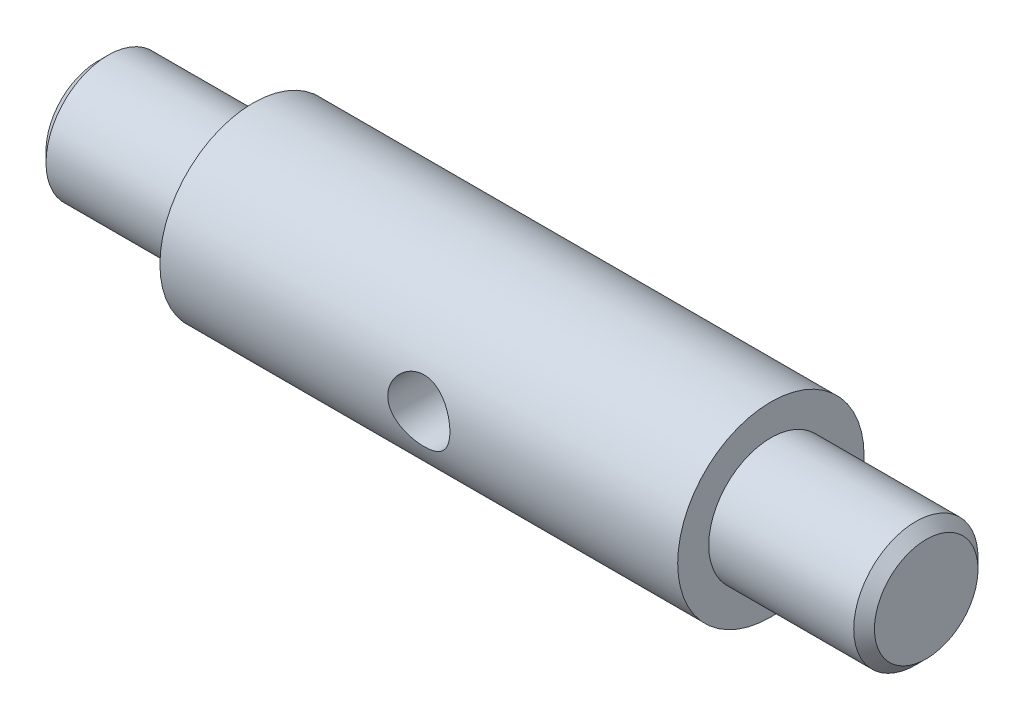
ISO-10303-21;
HEADER;
FILE_DESCRIPTION(('STEP AP214'),'2;1');
FILE_NAME('part.step','',(''),(''),'','','');
FILE_SCHEMA(('AUTOMOTIVE_DESIGN { 1 0 10303 214 1 1 1 1 }'));
ENDSEC;
DATA;
#1=APPLICATION_CONTEXT('core data for automotive mechanical design processes');
#2=APPLICATION_PROTOCOL_DEFINITION('international standard','automotive_design',2000,#1);
#3=PRODUCT_CONTEXT('',#1,'mechanical');
#4=PRODUCT('Part','Part','',(#3));
#5=PRODUCT_RELATED_PRODUCT_CATEGORY('part','',(#4));
#6=PRODUCT_DEFINITION_FORMATION('','',#4);
#7=PRODUCT_DEFINITION_CONTEXT('part definition',#1,'design');
#8=PRODUCT_DEFINITION('design','',#6,#7);
#9=PRODUCT_DEFINITION_SHAPE('','',#8);
#10=(LENGTH_UNIT() NAMED_UNIT(*) SI_UNIT(.MILLI.,.METRE.));
#11=(NAMED_UNIT(*) PLANE_ANGLE_UNIT() SI_UNIT($,.RADIAN.));
#12=(NAMED_UNIT(*) SI_UNIT($,.STERADIAN.) SOLID_ANGLE_UNIT());
#13=UNCERTAINTY_MEASURE_WITH_UNIT(LENGTH_MEASURE(1.E-05),#10,'distance_accuracy_value','');
#14=(GEOMETRIC_REPRESENTATION_CONTEXT(3) GLOBAL_UNCERTAINTY_ASSIGNED_CONTEXT((#13)) GLOBAL_UNIT_ASSIGNED_CONTEXT((#10,
#11,#12)) REPRESENTATION_CONTEXT('',''));
#15=CARTESIAN_POINT('',(0.,0.,0.));
#16=DIRECTION('',(0.,0.,1.));
#17=DIRECTION('',(1.,0.,0.));
#18=AXIS2_PLACEMENT_3D('',#15,#16,#17);
#19=CARTESIAN_POINT('',(0.,0.,-9.00000000000001));
#20=DIRECTION('',(0.,0.,1.));
#21=DIRECTION('',(1.,0.,0.));
#22=AXIS2_PLACEMENT_3D('',#19,#20,#21);
#23=CYLINDRICAL_SURFACE('',#22,3.);
#24=CARTESIAN_POINT('',(3.,0.,9.00000000000001));
#25=CARTESIAN_POINT('',(3.00000076119492,-0.16369008866017,9.00000045902833));
#26=CARTESIAN_POINT('',(2.98655920161835,-0.32737558361565,8.99549308522635));
#27=CARTESIAN_POINT('',(2.93331267354834,-0.649925282618917,8.97795630609843));
#28=CARTESIAN_POINT('',(2.89350496815323,-0.808788984356453,8.96492601606458));
#29=CARTESIAN_POINT('',(2.78904226984785,-1.11699836850533,8.93175923719328));
#30=CARTESIAN_POINT('',(2.72442881262219,-1.2663594776581,8.9116346319256));
#31=CARTESIAN_POINT('',(2.57237648148496,-1.55212481041597,8.86633337152026));
#32=CARTESIAN_POINT('',(2.4849331049922,-1.68852647087612,8.84115572003334));
#33=CARTESIAN_POINT('',(2.28652258542374,-1.9492250250668,8.78742283329015));
#34=CARTESIAN_POINT('',(2.17490629721852,-2.07301110089493,8.75878669391355));
#35=CARTESIAN_POINT('',(1.9326985358803,-2.30049807810625,8.70180944349365));
#36=CARTESIAN_POINT('',(1.80210289521446,-2.40419455646839,8.67346839871647));
#37=CARTESIAN_POINT('',(1.52104465441062,-2.59147482668358,8.61939997431822));
#38=CARTESIAN_POINT('',(1.37011878080363,-2.6743945746631,8.59377117827065));
#39=CARTESIAN_POINT('',(1.05547171662436,-2.81345662163316,8.54925916255804));
#40=CARTESIAN_POINT('',(0.891754448511768,-2.86960709216029,8.53037388482237));
#41=CARTESIAN_POINT('',(0.561980335509868,-2.95162038452749,8.50233909808132));
#42=CARTESIAN_POINT('',(0.396188374532806,-2.97844034481531,8.49288287308834));
#43=CARTESIAN_POINT('',(0.0622087375323573,-3.00402337000343,8.48386969888523));
#44=CARTESIAN_POINT('',(-0.105978182127572,-3.00279510481416,8.4843096906819));
#45=CARTESIAN_POINT('',(-0.431809891332064,-2.97305971111026,8.49477045024541));
#46=CARTESIAN_POINT('',(-0.589585208757056,-2.94580173950098,8.50435247602599));
#47=CARTESIAN_POINT('',(-0.898180258820504,-2.86681848854825,8.53129973173653));
#48=CARTESIAN_POINT('',(-1.04899915630521,-2.81509027977561,8.54866589352323));
#49=CARTESIAN_POINT('',(-1.34223824877444,-2.68781717418063,8.58953733393747));
#50=CARTESIAN_POINT('',(-1.48448407640858,-2.61190214612179,8.61313697379352));
#51=CARTESIAN_POINT('',(-1.75461272483918,-2.43866731890942,8.6637767572718));
#52=CARTESIAN_POINT('',(-1.88249138080014,-2.34134133709202,8.69081789371391));
#53=CARTESIAN_POINT('',(-2.12727479448232,-2.12204799804671,8.74701987503223));
#54=CARTESIAN_POINT('',(-2.24325808352721,-1.99905945022893,8.77621768064529));
#55=CARTESIAN_POINT('',(-2.45319379999019,-1.73501870991019,8.8322081516111));
#56=CARTESIAN_POINT('',(-2.54714411449349,-1.59396478698244,8.85900058614202));
#57=CARTESIAN_POINT('',(-2.71108890070521,-1.2958428391388,8.90751323813381));
#58=CARTESIAN_POINT('',(-2.7808364740222,-1.13862982924901,8.92918050024118));
#59=CARTESIAN_POINT('',(-2.89260952186713,-0.813807250093524,8.96461701433305));
#60=CARTESIAN_POINT('',(-2.93464462627031,-0.646201314464862,8.97838900964638));
#61=CARTESIAN_POINT('',(-2.98816699806708,-0.313151488587913,8.99602881214322));
#62=CARTESIAN_POINT('',(-3.00089942751825,-0.14792879959454,9.00030005501184));
#63=CARTESIAN_POINT('',(-2.99900197920459,0.182325209880711,8.99966708084482));
#64=CARTESIAN_POINT('',(-2.98437672006037,0.34735655795895,8.99476441258087));
#65=CARTESIAN_POINT('',(-2.92916427679212,0.667559598912766,8.97660074151313));
#66=CARTESIAN_POINT('',(-2.88934138185152,0.822878420504529,8.96358596133577));
#67=CARTESIAN_POINT('',(-2.78581966659982,1.12456787573872,8.9307554049021));
#68=CARTESIAN_POINT('',(-2.72211780159664,1.27093736552582,8.91093876140025));
#69=CARTESIAN_POINT('',(-2.57078870447764,1.55486488917982,8.86586793861869));
#70=CARTESIAN_POINT('',(-2.48257622015049,1.69208987765144,8.84048444267359));
#71=CARTESIAN_POINT('',(-2.28541754995955,1.95019449040676,8.78715761748788));
#72=CARTESIAN_POINT('',(-2.17646503190471,2.07106910338673,8.75921350781483));
#73=CARTESIAN_POINT('',(-1.93506374698024,2.2987575234189,8.70230543941334));
#74=CARTESIAN_POINT('',(-1.80177231921942,2.40468290773731,8.67335283262284));
#75=CARTESIAN_POINT('',(-1.51868529656734,2.59277256697072,8.61899919884127));
#76=CARTESIAN_POINT('',(-1.36888956409777,2.67493664379304,8.59359820146007));
#77=CARTESIAN_POINT('',(-1.05698095413031,2.81279079124908,8.54947175374151));
#78=CARTESIAN_POINT('',(-0.894893762493705,2.86853439649506,8.53073282378937));
#79=CARTESIAN_POINT('',(-0.56286404986761,2.95168400027807,8.50232496919349));
#80=CARTESIAN_POINT('',(-0.392925103786953,2.97910276486182,8.49265195870918));
#81=CARTESIAN_POINT('',(-0.0594087118772516,3.00382884743203,8.48393576622532));
#82=CARTESIAN_POINT('',(0.10404702086047,3.0026107719252,8.48437200772246));
#83=CARTESIAN_POINT('',(0.428295224766187,2.97372688034608,8.49453809471602));
#84=CARTESIAN_POINT('',(0.589087853865265,2.94606263837576,8.50426738708085));
#85=CARTESIAN_POINT('',(0.900406989007416,2.86611543938804,8.53153572914675));
#86=CARTESIAN_POINT('',(1.05107047501349,2.81431003804654,8.54892294067433));
#87=CARTESIAN_POINT('',(1.34168222081481,2.68793809727924,8.58949196455406));
#88=CARTESIAN_POINT('',(1.48162809356402,2.61336650566142,8.6126750629018));
#89=CARTESIAN_POINT('',(1.75345100976873,2.43978207775029,8.66348487678139));
#90=CARTESIAN_POINT('',(1.88470950569516,2.33984472829374,8.69126134926412));
#91=CARTESIAN_POINT('',(2.1290694401526,2.11992864940695,8.74750068849759));
#92=CARTESIAN_POINT('',(2.24216572706422,1.99994425335445,8.77596374737117));
#93=CARTESIAN_POINT('',(2.45143323686753,1.73772467076207,8.83170091576632));
#94=CARTESIAN_POINT('',(2.546773043253,1.59480454049919,8.8588854540377));
#95=CARTESIAN_POINT('',(2.71197128655194,1.29407207221988,8.90777973517837));
#96=CARTESIAN_POINT('',(2.78183623776613,1.13626355439705,8.9294908772379));
#97=CARTESIAN_POINT('',(2.89116489746602,0.817480941602929,8.96416545205626));
#98=CARTESIAN_POINT('',(2.93184739879013,0.656963273029227,8.97747637267568));
#99=CARTESIAN_POINT('',(2.98626084203138,0.330961248030742,8.99539221192666));
#100=CARTESIAN_POINT('',(2.99999923048961,0.165478276706239,8.99999953595715));
#101=CARTESIAN_POINT('',(3.,0.,9.00000000000001));
#102=B_SPLINE_CURVE_WITH_KNOTS('',3,(#24,#25,#26,#27,#28,#29,#30,#31,#32,#33,#34,#35,#36,#37,
#38,#39,#40,#41,#42,#43,#44,#45,#46,#47,#48,#49,#50,#51,#52,#53,#54,#55,#56,#57,#58,#59,#60,#61,
#62,#63,#64,#65,#66,#67,#68,#69,#70,#71,#72,#73,#74,#75,#76,#77,#78,#79,#80,#81,#82,#83,#84,#85,
#86,#87,#88,#89,#90,#91,#92,#93,#94,#95,#96,#97,#98,#99,#100,#101),.UNSPECIFIED.,.T.,.F.,(4,2,2,
2,2,2,2,2,2,2,2,2,2,2,2,2,2,2,2,2,2,2,2,2,2,2,2,2,2,2,2,2,2,2,2,2,2,2,4),(0.,0.490461318078033,
0.980973555802562,1.47066801861082,1.9604591333973,2.46554052848268,2.97073299862591,
3.49045154470412,4.010011340785,4.5120577722552,5.01394901962456,5.49290479653841,
5.97191792566446,6.45864513465392,6.94551307674622,7.45779917434101,7.97013437899855,
8.48755216951073,9.00479006631625,9.49960749525509,9.9943413949253,10.4747447393464,
10.9552093585231,11.4483119953121,11.9415654246567,12.4572306864226,12.9729002470499,
13.4875204148031,14.0019085411752,14.4898699819277,14.9778023805413,15.4564676124125,
15.9352391452793,16.4349020007541,16.9347063337134,17.453989825053,17.9731404345737,
18.4690967512144,18.9649159811442),.UNSPECIFIED.);
#103=CARTESIAN_POINT('',(3.,0.,9.00000000000001));
#104=VERTEX_POINT('',#103);
#105=EDGE_CURVE('E106',#104,#104,#102,.T.);
#106=ORIENTED_EDGE('',*,*,#105,.F.);
#107=EDGE_LOOP('',(#106));
#108=FACE_BOUND('',#107,.T.);
#109=CARTESIAN_POINT('',(0.,0.,0.));
#110=DIRECTION('',(0.707106781186547,0.,0.707106781186547));
#111=DIRECTION('',(-0.707106781186547,0.,0.707106781186547));
#112=AXIS2_PLACEMENT_3D('',#109,#110,#111);
#113=ELLIPSE('',#112,4.24264068711928,3.);
#114=CARTESIAN_POINT('',(0.,-3.,0.));
#115=VERTEX_POINT('',#114);
#116=CARTESIAN_POINT('',(0.,3.,0.));
#117=VERTEX_POINT('',#116);
#118=EDGE_CURVE('E62',#115,#117,#113,.F.);
#119=ORIENTED_EDGE('',*,*,#118,.T.);
#120=CARTESIAN_POINT('',(0.,0.,0.));
#121=DIRECTION('',(-0.707106781186547,0.,0.707106781186547));
#122=DIRECTION('',(0.707106781186547,0.,0.707106781186547));
#123=AXIS2_PLACEMENT_3D('',#120,#121,#122);
#124=ELLIPSE('',#123,4.24264068711928,3.);
#125=EDGE_CURVE('E192',#117,#115,#124,.F.);
#126=ORIENTED_EDGE('',*,*,#125,.T.);
#127=EDGE_LOOP('',(#119,#126));
#128=FACE_BOUND('',#127,.T.);
#129=ADVANCED_FACE('F46',(#108,#128),#23,.F.);
#130=CARTESIAN_POINT('',(-40.,0.,0.));
#131=DIRECTION('',(1.,0.,0.));
#132=DIRECTION('',(0.,0.,-1.));
#133=AXIS2_PLACEMENT_3D('',#130,#131,#132);
#134=PLANE('',#133);
#135=CARTESIAN_POINT('',(-40.,0.,0.));
#136=DIRECTION('',(1.,0.,0.));
#137=DIRECTION('',(0.,0.,-1.));
#138=AXIS2_PLACEMENT_3D('',#135,#136,#137);
#139=CIRCLE('',#138,4.99999999999998);
#140=CARTESIAN_POINT('',(-40.,0.,-4.99999999999998));
#141=VERTEX_POINT('',#140);
#142=EDGE_CURVE('E56',#141,#141,#139,.F.);
#143=ORIENTED_EDGE('',*,*,#142,.T.);
#144=EDGE_LOOP('',(#143));
#145=FACE_BOUND('',#144,.T.);
#146=CARTESIAN_POINT('',(-40.,0.,0.));
#147=DIRECTION('',(-1.,0.,0.));
#148=DIRECTION('',(0.,0.,1.));
#149=AXIS2_PLACEMENT_3D('',#146,#147,#148);
#150=CIRCLE('',#149,3.);
#151=CARTESIAN_POINT('',(-40.,0.,3.));
#152=VERTEX_POINT('',#151);
#153=EDGE_CURVE('E85',#152,#152,#150,.T.);
#154=ORIENTED_EDGE('',*,*,#153,.F.);
#155=EDGE_LOOP('',(#154));
#156=FACE_BOUND('',#155,.T.);
#157=ADVANCED_FACE('F151',(#145,#156),#134,.F.);
#158=CARTESIAN_POINT('',(0.,0.,0.));
#159=DIRECTION('',(-1.,0.,0.));
#160=DIRECTION('',(0.,0.,1.));
#161=AXIS2_PLACEMENT_3D('',#158,#159,#160);
#162=CYLINDRICAL_SURFACE('',#161,6.);
#163=CARTESIAN_POINT('',(-39.,0.,0.));
#164=DIRECTION('',(1.,0.,0.));
#165=DIRECTION('',(0.,0.,-1.));
#166=AXIS2_PLACEMENT_3D('',#163,#164,#165);
#167=CIRCLE('',#166,6.);
#168=CARTESIAN_POINT('',(-39.,0.,-6.));
#169=VERTEX_POINT('',#168);
#170=EDGE_CURVE('E11',#169,#169,#167,.T.);
#171=ORIENTED_EDGE('',*,*,#170,.T.);
#172=EDGE_LOOP('',(#171));
#173=FACE_BOUND('',#172,.T.);
#174=CARTESIAN_POINT('',(-25.,0.,0.));
#175=DIRECTION('',(-1.,0.,0.));
#176=DIRECTION('',(0.,0.,1.));
#177=AXIS2_PLACEMENT_3D('',#174,#175,#176);
#178=CIRCLE('',#177,6.);
#179=CARTESIAN_POINT('',(-25.,0.,6.));
#180=VERTEX_POINT('',#179);
#181=EDGE_CURVE('E102',#180,#180,#178,.T.);
#182=ORIENTED_EDGE('',*,*,#181,.T.);
#183=EDGE_LOOP('',(#182));
#184=FACE_BOUND('',#183,.T.);
#185=ADVANCED_FACE('F157',(#173,#184),#162,.T.);
#186=CARTESIAN_POINT('',(-25.,6.,0.));
#187=DIRECTION('',(1.,0.,0.));
#188=DIRECTION('',(0.,0.,-1.));
#189=AXIS2_PLACEMENT_3D('',#186,#187,#188);
#190=PLANE('',#189);
#191=ORIENTED_EDGE('',*,*,#181,.F.);
#192=EDGE_LOOP('',(#191));
#193=FACE_BOUND('',#192,.T.);
#194=CARTESIAN_POINT('',(-25.,0.,0.));
#195=DIRECTION('',(-1.,0.,0.));
#196=DIRECTION('',(0.,0.,1.));
#197=AXIS2_PLACEMENT_3D('',#194,#195,#196);
#198=CIRCLE('',#197,9.);
#199=CARTESIAN_POINT('',(-25.,0.,9.));
#200=VERTEX_POINT('',#199);
#201=EDGE_CURVE('E98',#200,#200,#198,.T.);
#202=ORIENTED_EDGE('',*,*,#201,.T.);
#203=EDGE_LOOP('',(#202));
#204=FACE_BOUND('',#203,.T.);
#205=ADVANCED_FACE('F146',(#193,#204),#190,.F.);
#206=CARTESIAN_POINT('',(0.,0.,0.));
#207=DIRECTION('',(-1.,0.,0.));
#208=DIRECTION('',(0.,0.,1.));
#209=AXIS2_PLACEMENT_3D('',#206,#207,#208);
#210=CYLINDRICAL_SURFACE('',#209,9.);
#211=CARTESIAN_POINT('',(3.,0.,-9.));
#212=CARTESIAN_POINT('',(3.00000076119492,0.16369008866017,-9.00000045902832));
#213=CARTESIAN_POINT('',(2.98655920161835,0.32737558361565,-8.99549308522635));
#214=CARTESIAN_POINT('',(2.93331267354834,0.649925282618917,-8.97795630609843));
#215=CARTESIAN_POINT('',(2.89350496815323,0.808788984356453,-8.96492601606458));
#216=CARTESIAN_POINT('',(2.78904226984785,1.11699836850533,-8.93175923719328));
#217=CARTESIAN_POINT('',(2.72442881262219,1.2663594776581,-8.9116346319256));
#218=CARTESIAN_POINT('',(2.57237648148496,1.55212481041597,-8.86633337152026));
#219=CARTESIAN_POINT('',(2.4849331049922,1.68852647087612,-8.84115572003334));
#220=CARTESIAN_POINT('',(2.28652258542374,1.9492250250668,-8.78742283329015));
#221=CARTESIAN_POINT('',(2.17490629721852,2.07301110089493,-8.75878669391355));
#222=CARTESIAN_POINT('',(1.9326985358803,2.30049807810625,-8.70180944349365));
#223=CARTESIAN_POINT('',(1.80210289521446,2.40419455646839,-8.67346839871647));
#224=CARTESIAN_POINT('',(1.52104465441062,2.59147482668358,-8.61939997431822));
#225=CARTESIAN_POINT('',(1.37011878080363,2.6743945746631,-8.59377117827065));
#226=CARTESIAN_POINT('',(1.05547171662436,2.81345662163316,-8.54925916255804));
#227=CARTESIAN_POINT('',(0.891754448511768,2.86960709216029,-8.53037388482237));
#228=CARTESIAN_POINT('',(0.561980335509868,2.95162038452749,-8.50233909808132));
#229=CARTESIAN_POINT('',(0.396188374532806,2.97844034481531,-8.49288287308834));
#230=CARTESIAN_POINT('',(0.0622087375323573,3.00402337000343,-8.48386969888523));
#231=CARTESIAN_POINT('',(-0.105978182127572,3.00279510481416,-8.4843096906819));
#232=CARTESIAN_POINT('',(-0.431809891332064,2.97305971111026,-8.49477045024541));
#233=CARTESIAN_POINT('',(-0.589585208757056,2.94580173950098,-8.50435247602599));
#234=CARTESIAN_POINT('',(-0.898180258820504,2.86681848854825,-8.53129973173653));
#235=CARTESIAN_POINT('',(-1.04899915630521,2.81509027977561,-8.54866589352323));
#236=CARTESIAN_POINT('',(-1.34223824877444,2.68781717418063,-8.58953733393747));
#237=CARTESIAN_POINT('',(-1.48448407640858,2.61190214612179,-8.61313697379352));
#238=CARTESIAN_POINT('',(-1.75461272483918,2.43866731890942,-8.6637767572718));
#239=CARTESIAN_POINT('',(-1.88249138080014,2.34134133709202,-8.69081789371391));
#240=CARTESIAN_POINT('',(-2.12727479448232,2.12204799804671,-8.74701987503223));
#241=CARTESIAN_POINT('',(-2.24325808352721,1.99905945022893,-8.77621768064529));
#242=CARTESIAN_POINT('',(-2.45319379999019,1.73501870991019,-8.8322081516111));
#243=CARTESIAN_POINT('',(-2.54714411449349,1.59396478698244,-8.85900058614202));
#244=CARTESIAN_POINT('',(-2.71108890070521,1.2958428391388,-8.90751323813381));
#245=CARTESIAN_POINT('',(-2.7808364740222,1.13862982924901,-8.92918050024118));
#246=CARTESIAN_POINT('',(-2.89260952186713,0.813807250093524,-8.96461701433305));
#247=CARTESIAN_POINT('',(-2.93464462627031,0.646201314464862,-8.97838900964638));
#248=CARTESIAN_POINT('',(-2.98816699806708,0.313151488587913,-8.99602881214322));
#249=CARTESIAN_POINT('',(-3.00089942751825,0.14792879959454,-9.00030005501184));
#250=CARTESIAN_POINT('',(-2.99900197920459,-0.182325209880711,-8.99966708084482));
#251=CARTESIAN_POINT('',(-2.98437672006037,-0.34735655795895,-8.99476441258087));
#252=CARTESIAN_POINT('',(-2.92916427679212,-0.667559598912766,-8.97660074151313));
#253=CARTESIAN_POINT('',(-2.88934138185152,-0.822878420504529,-8.96358596133577));
#254=CARTESIAN_POINT('',(-2.78581966659982,-1.12456787573872,-8.9307554049021));
#255=CARTESIAN_POINT('',(-2.72211780159664,-1.27093736552582,-8.91093876140025));
#256=CARTESIAN_POINT('',(-2.57078870447764,-1.55486488917982,-8.86586793861869));
#257=CARTESIAN_POINT('',(-2.48257622015049,-1.69208987765144,-8.84048444267359));
#258=CARTESIAN_POINT('',(-2.28541754995955,-1.95019449040676,-8.78715761748788));
#259=CARTESIAN_POINT('',(-2.17646503190471,-2.07106910338673,-8.75921350781483));
#260=CARTESIAN_POINT('',(-1.93506374698024,-2.2987575234189,-8.70230543941334));
#261=CARTESIAN_POINT('',(-1.80177231921942,-2.40468290773731,-8.67335283262284));
#262=CARTESIAN_POINT('',(-1.51868529656734,-2.59277256697072,-8.61899919884127));
#263=CARTESIAN_POINT('',(-1.36888956409777,-2.67493664379304,-8.59359820146007));
#264=CARTESIAN_POINT('',(-1.05698095413031,-2.81279079124908,-8.54947175374151));
#265=CARTESIAN_POINT('',(-0.894893762493705,-2.86853439649506,-8.53073282378937));
#266=CARTESIAN_POINT('',(-0.56286404986761,-2.95168400027807,-8.50232496919349));
#267=CARTESIAN_POINT('',(-0.392925103786953,-2.97910276486182,-8.49265195870918));
#268=CARTESIAN_POINT('',(-0.0594087118772516,-3.00382884743203,-8.48393576622532));
#269=CARTESIAN_POINT('',(0.10404702086047,-3.0026107719252,-8.48437200772246));
#270=CARTESIAN_POINT('',(0.428295224766187,-2.97372688034608,-8.49453809471602));
#271=CARTESIAN_POINT('',(0.589087853865265,-2.94606263837576,-8.50426738708085));
#272=CARTESIAN_POINT('',(0.900406989007416,-2.86611543938804,-8.53153572914675));
#273=CARTESIAN_POINT('',(1.05107047501349,-2.81431003804654,-8.54892294067433));
#274=CARTESIAN_POINT('',(1.34168222081481,-2.68793809727924,-8.58949196455406));
#275=CARTESIAN_POINT('',(1.48162809356402,-2.61336650566142,-8.6126750629018));
#276=CARTESIAN_POINT('',(1.75345100976873,-2.43978207775029,-8.66348487678139));
#277=CARTESIAN_POINT('',(1.88470950569516,-2.33984472829374,-8.69126134926412));
#278=CARTESIAN_POINT('',(2.1290694401526,-2.11992864940695,-8.74750068849759));
#279=CARTESIAN_POINT('',(2.24216572706422,-1.99994425335445,-8.77596374737117));
#280=CARTESIAN_POINT('',(2.45143323686753,-1.73772467076207,-8.83170091576632));
#281=CARTESIAN_POINT('',(2.546773043253,-1.59480454049919,-8.8588854540377));
#282=CARTESIAN_POINT('',(2.71197128655194,-1.29407207221988,-8.90777973517837));
#283=CARTESIAN_POINT('',(2.78183623776613,-1.13626355439705,-8.9294908772379));
#284=CARTESIAN_POINT('',(2.89116489746602,-0.817480941602929,-8.96416545205626));
#285=CARTESIAN_POINT('',(2.93184739879013,-0.656963273029227,-8.97747637267568));
#286=CARTESIAN_POINT('',(2.98626084203138,-0.330961248030742,-8.99539221192665));
#287=CARTESIAN_POINT('',(2.99999923048961,-0.16547827670624,-8.99999953595715));
#288=CARTESIAN_POINT('',(3.,0.,-9.));
#289=B_SPLINE_CURVE_WITH_KNOTS('',3,(#211,#212,#213,#214,#215,#216,#217,#218,#219,#220,#221,
#222,#223,#224,#225,#226,#227,#228,#229,#230,#231,#232,#233,#234,#235,#236,#237,#238,#239,#240,
#241,#242,#243,#244,#245,#246,#247,#248,#249,#250,#251,#252,#253,#254,#255,#256,#257,#258,#259,
#260,#261,#262,#263,#264,#265,#266,#267,#268,#269,#270,#271,#272,#273,#274,#275,#276,#277,#278,
#279,#280,#281,#282,#283,#284,#285,#286,#287,#288),.UNSPECIFIED.,.T.,.F.,(4,2,2,2,2,2,2,2,2,2,2,
2,2,2,2,2,2,2,2,2,2,2,2,2,2,2,2,2,2,2,2,2,2,2,2,2,2,2,4),(0.,0.490461318078033,
0.980973555802562,1.47066801861082,1.9604591333973,2.46554052848268,2.97073299862591,
3.49045154470411,4.010011340785,4.5120577722552,5.01394901962456,5.49290479653841,
5.97191792566446,6.45864513465392,6.94551307674622,7.45779917434101,7.97013437899855,
8.48755216951073,9.00479006631625,9.49960749525509,9.9943413949253,10.4747447393464,
10.9552093585231,11.4483119953121,11.9415654246567,12.4572306864226,12.9729002470499,
13.4875204148031,14.0019085411752,14.4898699819277,14.9778023805413,15.4564676124125,
15.9352391452793,16.4349020007541,16.9347063337134,17.453989825053,17.9731404345737,
18.4690967512144,18.9649159811442),.UNSPECIFIED.);
#290=CARTESIAN_POINT('',(3.,0.,-9.));
#291=VERTEX_POINT('',#290);
#292=EDGE_CURVE('E115',#291,#291,#289,.T.);
#293=ORIENTED_EDGE('',*,*,#292,.T.);
#294=EDGE_LOOP('',(#293));
#295=FACE_BOUND('',#294,.T.);
#296=ORIENTED_EDGE('',*,*,#105,.T.);
#297=EDGE_LOOP('',(#296));
#298=FACE_BOUND('',#297,.T.);
#299=ORIENTED_EDGE('',*,*,#201,.F.);
#300=EDGE_LOOP('',(#299));
#301=FACE_BOUND('',#300,.T.);
#302=CARTESIAN_POINT('',(25.,0.,0.));
#303=DIRECTION('',(-1.,0.,0.));
#304=DIRECTION('',(0.,0.,1.));
#305=AXIS2_PLACEMENT_3D('',#302,#303,#304);
#306=CIRCLE('',#305,9.00000000000001);
#307=CARTESIAN_POINT('',(25.,0.,9.00000000000001));
#308=VERTEX_POINT('',#307);
#309=EDGE_CURVE('E90',#308,#308,#306,.T.);
#310=ORIENTED_EDGE('',*,*,#309,.T.);
#311=EDGE_LOOP('',(#310));
#312=FACE_BOUND('',#311,.T.);
#313=ADVANCED_FACE('F120',(#295,#298,#301,#312),#210,.T.);
#314=CARTESIAN_POINT('',(25.,9.00000000000001,0.));
#315=DIRECTION('',(-1.,0.,0.));
#316=DIRECTION('',(0.,0.,1.));
#317=AXIS2_PLACEMENT_3D('',#314,#315,#316);
#318=PLANE('',#317);
#319=ORIENTED_EDGE('',*,*,#309,.F.);
#320=EDGE_LOOP('',(#319));
#321=FACE_BOUND('',#320,.T.);
#322=CARTESIAN_POINT('',(25.,0.,0.));
#323=DIRECTION('',(-1.,0.,0.));
#324=DIRECTION('',(0.,0.,1.));
#325=AXIS2_PLACEMENT_3D('',#322,#323,#324);
#326=CIRCLE('',#325,6.00000000000001);
#327=CARTESIAN_POINT('',(25.,0.,6.00000000000001));
#328=VERTEX_POINT('',#327);
#329=EDGE_CURVE('E84',#328,#328,#326,.T.);
#330=ORIENTED_EDGE('',*,*,#329,.T.);
#331=EDGE_LOOP('',(#330));
#332=FACE_BOUND('',#331,.T.);
#333=ADVANCED_FACE('F138',(#321,#332),#318,.F.);
#334=CARTESIAN_POINT('',(0.,0.,0.));
#335=DIRECTION('',(-1.,0.,0.));
#336=DIRECTION('',(0.,0.,1.));
#337=AXIS2_PLACEMENT_3D('',#334,#335,#336);
#338=CYLINDRICAL_SURFACE('',#337,6.00000000000001);
#339=CARTESIAN_POINT('',(39.,0.,0.));
#340=DIRECTION('',(-1.,0.,0.));
#341=DIRECTION('',(0.,0.,1.));
#342=AXIS2_PLACEMENT_3D('',#339,#340,#341);
#343=CIRCLE('',#342,6.00000000000001);
#344=CARTESIAN_POINT('',(39.,0.,6.00000000000001));
#345=VERTEX_POINT('',#344);
#346=EDGE_CURVE('E190',#345,#345,#343,.T.);
#347=ORIENTED_EDGE('',*,*,#346,.T.);
#348=EDGE_LOOP('',(#347));
#349=FACE_BOUND('',#348,.T.);
#350=ORIENTED_EDGE('',*,*,#329,.F.);
#351=EDGE_LOOP('',(#350));
#352=FACE_BOUND('',#351,.T.);
#353=ADVANCED_FACE('F135',(#349,#352),#338,.T.);
#354=CARTESIAN_POINT('',(40.,6.00000000000001,0.));
#355=DIRECTION('',(-1.,0.,0.));
#356=DIRECTION('',(0.,0.,1.));
#357=AXIS2_PLACEMENT_3D('',#354,#355,#356);
#358=PLANE('',#357);
#359=CARTESIAN_POINT('',(40.,0.,0.));
#360=DIRECTION('',(-1.,0.,0.));
#361=DIRECTION('',(0.,0.,1.));
#362=AXIS2_PLACEMENT_3D('',#359,#360,#361);
#363=CIRCLE('',#362,5.);
#364=CARTESIAN_POINT('',(40.,0.,5.));
#365=VERTEX_POINT('',#364);
#366=EDGE_CURVE('E187',#365,#365,#363,.F.);
#367=ORIENTED_EDGE('',*,*,#366,.T.);
#368=EDGE_LOOP('',(#367));
#369=FACE_BOUND('',#368,.T.);
#370=ADVANCED_FACE('F129',(#369),#358,.F.);
#371=CARTESIAN_POINT('',(0.,0.,0.));
#372=DIRECTION('',(0.707106781186547,0.,0.707106781186547));
#373=DIRECTION('',(-0.707106781186547,0.,0.707106781186547));
#374=AXIS2_PLACEMENT_3D('',#371,#372,#373);
#375=ELLIPSE('',#374,4.24264068711928,3.);
#376=EDGE_CURVE('E69',#115,#117,#375,.T.);
#377=ORIENTED_EDGE('',*,*,#376,.T.);
#378=CARTESIAN_POINT('',(0.,0.,0.));
#379=DIRECTION('',(-0.707106781186547,0.,0.707106781186547));
#380=DIRECTION('',(0.707106781186547,0.,0.707106781186547));
#381=AXIS2_PLACEMENT_3D('',#378,#379,#380);
#382=ELLIPSE('',#381,4.24264068711928,3.);
#383=EDGE_CURVE('E197',#117,#115,#382,.T.);
#384=ORIENTED_EDGE('',*,*,#383,.T.);
#385=EDGE_LOOP('',(#377,#384));
#386=FACE_BOUND('',#385,.T.);
#387=ORIENTED_EDGE('',*,*,#292,.F.);
#388=EDGE_LOOP('',(#387));
#389=FACE_BOUND('',#388,.T.);
#390=ADVANCED_FACE('F124',(#386,#389),#23,.F.);
#391=CARTESIAN_POINT('',(-40.,0.,0.));
#392=DIRECTION('',(-1.,0.,0.));
#393=DIRECTION('',(0.,0.,1.));
#394=AXIS2_PLACEMENT_3D('',#391,#392,#393);
#395=CYLINDRICAL_SURFACE('',#394,2.99999999999999);
#396=ORIENTED_EDGE('',*,*,#153,.T.);
#397=EDGE_LOOP('',(#396));
#398=FACE_BOUND('',#397,.T.);
#399=ORIENTED_EDGE('',*,*,#118,.F.);
#400=ORIENTED_EDGE('',*,*,#383,.F.);
#401=EDGE_LOOP('',(#399,#400));
#402=FACE_BOUND('',#401,.T.);
#403=ADVANCED_FACE('F128',(#398,#402),#395,.F.);
#404=CARTESIAN_POINT('',(4.99999999999999,0.,0.));
#405=DIRECTION('',(-1.,0.,0.));
#406=DIRECTION('',(0.,0.,1.));
#407=AXIS2_PLACEMENT_3D('',#404,#405,#406);
#408=CIRCLE('',#407,2.99999999999999);
#409=CARTESIAN_POINT('',(4.99999999999999,0.,2.99999999999999));
#410=VERTEX_POINT('',#409);
#411=EDGE_CURVE('E81',#410,#410,#408,.T.);
#412=ORIENTED_EDGE('',*,*,#411,.F.);
#413=EDGE_LOOP('',(#412));
#414=FACE_BOUND('',#413,.T.);
#415=ORIENTED_EDGE('',*,*,#376,.F.);
#416=ORIENTED_EDGE('',*,*,#125,.F.);
#417=EDGE_LOOP('',(#415,#416));
#418=FACE_BOUND('',#417,.T.);
#419=ADVANCED_FACE('F77',(#414,#418),#395,.F.);
#420=CARTESIAN_POINT('',(4.99999999999999,0.,0.));
#421=DIRECTION('',(-1.,0.,0.));
#422=DIRECTION('',(0.,0.,1.));
#423=AXIS2_PLACEMENT_3D('',#420,#421,#422);
#424=CONICAL_SURFACE('',#423,2.99999999999999,1.04719755119659);
#425=CARTESIAN_POINT('',(6.73205080756888,0.,0.));
#426=VERTEX_POINT('',#425);
#427=VERTEX_LOOP('',#426);
#428=FACE_BOUND('',#427,.T.);
#429=ORIENTED_EDGE('',*,*,#411,.T.);
#430=EDGE_LOOP('',(#429));
#431=FACE_BOUND('',#430,.T.);
#432=ADVANCED_FACE('F73',(#428,#431),#424,.F.);
#433=CARTESIAN_POINT('',(39.,0.,0.));
#434=DIRECTION('',(-1.,0.,0.));
#435=DIRECTION('',(0.,0.,1.));
#436=AXIS2_PLACEMENT_3D('',#433,#434,#435);
#437=CONICAL_SURFACE('',#436,6.00000000000001,0.785398163397457);
#438=ORIENTED_EDGE('',*,*,#366,.F.);
#439=EDGE_LOOP('',(#438));
#440=FACE_BOUND('',#439,.T.);
#441=ORIENTED_EDGE('',*,*,#346,.F.);
#442=EDGE_LOOP('',(#441));
#443=FACE_BOUND('',#442,.T.);
#444=ADVANCED_FACE('F76',(#440,#443),#437,.T.);
#445=CARTESIAN_POINT('',(-40.,0.,0.));
#446=DIRECTION('',(1.,0.,0.));
#447=DIRECTION('',(0.,0.,-1.));
#448=AXIS2_PLACEMENT_3D('',#445,#446,#447);
#449=CONICAL_SURFACE('',#448,4.99999999999998,0.785398163397446);
#450=ORIENTED_EDGE('',*,*,#170,.F.);
#451=EDGE_LOOP('',(#450));
#452=FACE_BOUND('',#451,.T.);
#453=ORIENTED_EDGE('',*,*,#142,.F.);
#454=EDGE_LOOP('',(#453));
#455=FACE_BOUND('',#454,.T.);
#456=ADVANCED_FACE('F49',(#452,#455),#449,.T.);
#457=CLOSED_SHELL('',(#129,#157,#185,#205,#313,#333,#353,#370,#390,#403,#419,#432,#444,#456));
#458=MANIFOLD_SOLID_BREP('B2',#457);
#459=ADVANCED_BREP_SHAPE_REPRESENTATION('',(#18,#458),#14);
#460=SHAPE_DEFINITION_REPRESENTATION(#9,#459);
ENDSEC;
END-ISO-10303-21;
